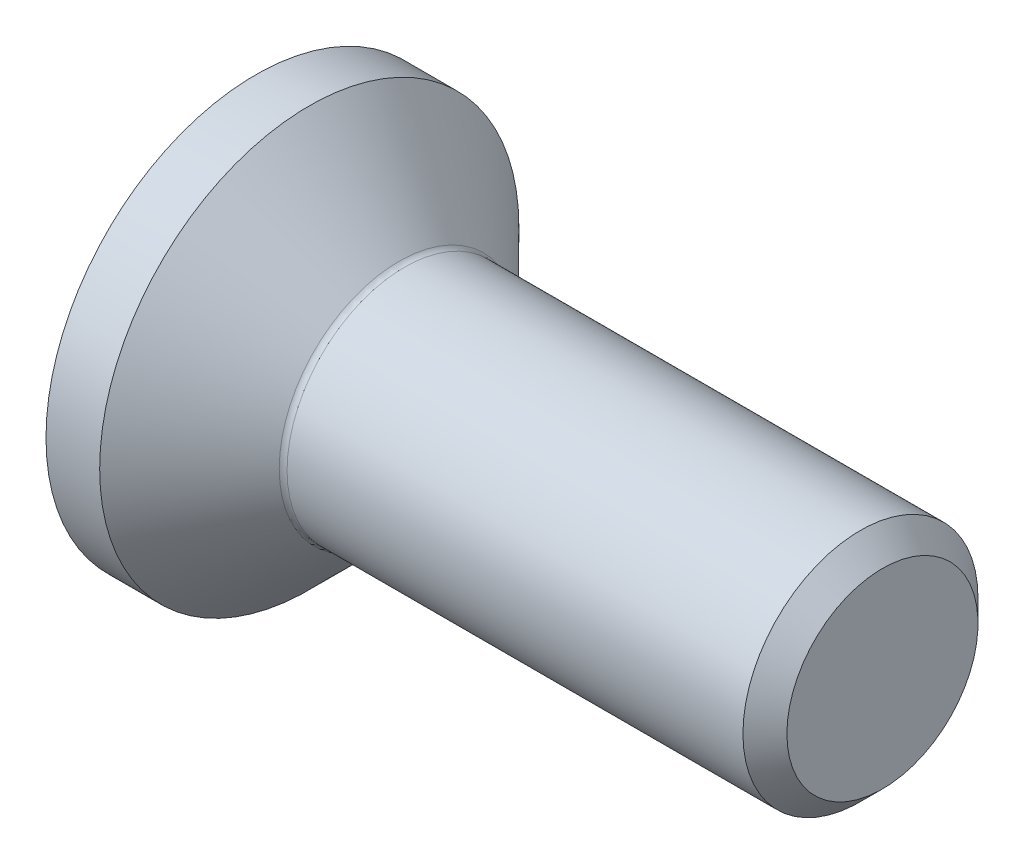
ISO-10303-21;
HEADER;
FILE_DESCRIPTION(('STEP AP214'),'2;1');
FILE_NAME('part.step','',(''),(''),'','','');
FILE_SCHEMA(('AUTOMOTIVE_DESIGN { 1 0 10303 214 1 1 1 1 }'));
ENDSEC;
DATA;
#1=APPLICATION_CONTEXT('core data for automotive mechanical design processes');
#2=APPLICATION_PROTOCOL_DEFINITION('international standard','automotive_design',2000,#1);
#3=PRODUCT_CONTEXT('',#1,'mechanical');
#4=PRODUCT('Part','Part','',(#3));
#5=PRODUCT_RELATED_PRODUCT_CATEGORY('part','',(#4));
#6=PRODUCT_DEFINITION_FORMATION('','',#4);
#7=PRODUCT_DEFINITION_CONTEXT('part definition',#1,'design');
#8=PRODUCT_DEFINITION('design','',#6,#7);
#9=PRODUCT_DEFINITION_SHAPE('','',#8);
#10=(LENGTH_UNIT() NAMED_UNIT(*) SI_UNIT(.MILLI.,.METRE.));
#11=(NAMED_UNIT(*) PLANE_ANGLE_UNIT() SI_UNIT($,.RADIAN.));
#12=(NAMED_UNIT(*) SI_UNIT($,.STERADIAN.) SOLID_ANGLE_UNIT());
#13=UNCERTAINTY_MEASURE_WITH_UNIT(LENGTH_MEASURE(1.E-05),#10,'distance_accuracy_value','');
#14=(GEOMETRIC_REPRESENTATION_CONTEXT(3) GLOBAL_UNCERTAINTY_ASSIGNED_CONTEXT((#13)) GLOBAL_UNIT_ASSIGNED_CONTEXT((#10,
#11,#12)) REPRESENTATION_CONTEXT('',''));
#15=CARTESIAN_POINT('',(0.,0.,0.));
#16=DIRECTION('',(0.,0.,1.));
#17=DIRECTION('',(1.,0.,0.));
#18=AXIS2_PLACEMENT_3D('',#15,#16,#17);
#19=CARTESIAN_POINT('',(0.,0.,0.));
#20=DIRECTION('',(-1.,0.,0.));
#21=DIRECTION('',(0.,0.,1.));
#22=AXIS2_PLACEMENT_3D('',#19,#20,#21);
#23=PLANE('',#22);
#24=CARTESIAN_POINT('',(0.,0.,0.));
#25=DIRECTION('',(-1.,0.,0.));
#26=DIRECTION('',(0.,0.,1.));
#27=AXIS2_PLACEMENT_3D('',#24,#25,#26);
#28=CIRCLE('',#27,2.675);
#29=CARTESIAN_POINT('',(0.,0.,2.675));
#30=VERTEX_POINT('',#29);
#31=EDGE_CURVE('E153',#30,#30,#28,.T.);
#32=ORIENTED_EDGE('',*,*,#31,.T.);
#33=EDGE_LOOP('',(#32));
#34=FACE_BOUND('',#33,.T.);
#35=DIRECTION('',(0.,-0.499999999999998,-0.86602540378444));
#36=VECTOR('',#35,1.);
#37=CARTESIAN_POINT('',(0.,-0.577350269189626,1.));
#38=LINE('',#37,#36);
#39=CARTESIAN_POINT('',(0.,-0.577350269189626,1.));
#40=VERTEX_POINT('',#39);
#41=CARTESIAN_POINT('',(0.,-1.15470053837925,0.));
#42=VERTEX_POINT('',#41);
#43=EDGE_CURVE('E119',#40,#42,#38,.T.);
#44=ORIENTED_EDGE('',*,*,#43,.T.);
#45=DIRECTION('',(0.,0.499999999999999,-0.866025403784439));
#46=VECTOR('',#45,1.);
#47=CARTESIAN_POINT('',(0.,-1.15470053837925,0.));
#48=LINE('',#47,#46);
#49=CARTESIAN_POINT('',(0.,-0.577350269189625,-1.));
#50=VERTEX_POINT('',#49);
#51=EDGE_CURVE('E50',#42,#50,#48,.T.);
#52=ORIENTED_EDGE('',*,*,#51,.T.);
#53=DIRECTION('',(0.,1.,0.));
#54=VECTOR('',#53,1.);
#55=CARTESIAN_POINT('',(0.,-0.577350269189625,-1.));
#56=LINE('',#55,#54);
#57=CARTESIAN_POINT('',(0.,0.577350269189626,-1.));
#58=VERTEX_POINT('',#57);
#59=EDGE_CURVE('E130',#50,#58,#56,.T.);
#60=ORIENTED_EDGE('',*,*,#59,.T.);
#61=DIRECTION('',(0.,0.5,0.866025403784439));
#62=VECTOR('',#61,1.);
#63=CARTESIAN_POINT('',(0.,0.577350269189626,-1.));
#64=LINE('',#63,#62);
#65=CARTESIAN_POINT('',(0.,1.15470053837925,0.));
#66=VERTEX_POINT('',#65);
#67=EDGE_CURVE('E254',#58,#66,#64,.T.);
#68=ORIENTED_EDGE('',*,*,#67,.T.);
#69=DIRECTION('',(0.,-0.499999999999999,0.866025403784439));
#70=VECTOR('',#69,1.);
#71=CARTESIAN_POINT('',(0.,1.15470053837925,0.));
#72=LINE('',#71,#70);
#73=CARTESIAN_POINT('',(0.,0.577350269189625,0.999999999999999));
#74=VERTEX_POINT('',#73);
#75=EDGE_CURVE('E257',#66,#74,#72,.T.);
#76=ORIENTED_EDGE('',*,*,#75,.T.);
#77=DIRECTION('',(0.,-1.,0.));
#78=VECTOR('',#77,1.);
#79=CARTESIAN_POINT('',(0.,0.577350269189625,0.999999999999999));
#80=LINE('',#79,#78);
#81=EDGE_CURVE('E260',#74,#40,#80,.T.);
#82=ORIENTED_EDGE('',*,*,#81,.T.);
#83=EDGE_LOOP('',(#44,#52,#60,#68,#76,#82));
#84=FACE_BOUND('',#83,.T.);
#85=ADVANCED_FACE('F35',(#34,#84),#23,.T.);
#86=CARTESIAN_POINT('',(0.,0.,0.));
#87=DIRECTION('',(-1.,0.,0.));
#88=DIRECTION('',(0.,0.,1.));
#89=AXIS2_PLACEMENT_3D('',#86,#87,#88);
#90=CYLINDRICAL_SURFACE('',#89,2.675);
#91=CARTESIAN_POINT('',(0.685000000000012,0.,0.));
#92=DIRECTION('',(-1.,0.,0.));
#93=DIRECTION('',(0.,0.,1.));
#94=AXIS2_PLACEMENT_3D('',#91,#92,#93);
#95=CIRCLE('',#94,2.675);
#96=CARTESIAN_POINT('',(0.685000000000012,0.,2.675));
#97=VERTEX_POINT('',#96);
#98=EDGE_CURVE('E150',#97,#97,#95,.T.);
#99=ORIENTED_EDGE('',*,*,#98,.T.);
#100=EDGE_LOOP('',(#99));
#101=FACE_BOUND('',#100,.T.);
#102=ORIENTED_EDGE('',*,*,#31,.F.);
#103=EDGE_LOOP('',(#102));
#104=FACE_BOUND('',#103,.T.);
#105=ADVANCED_FACE('F174',(#101,#104),#90,.T.);
#106=CARTESIAN_POINT('',(0.685000000000012,0.,0.));
#107=DIRECTION('',(-1.,0.,0.));
#108=DIRECTION('',(0.,0.,1.));
#109=AXIS2_PLACEMENT_3D('',#106,#107,#108);
#110=CONICAL_SURFACE('',#109,2.675,0.785398163397451);
#111=CARTESIAN_POINT('',(1.83071067811869,0.,0.));
#112=DIRECTION('',(-1.,0.,0.));
#113=DIRECTION('',(0.,0.,1.));
#114=AXIS2_PLACEMENT_3D('',#111,#112,#113);
#115=CIRCLE('',#114,1.52928932188132);
#116=CARTESIAN_POINT('',(1.83071067811869,0.,1.52928932188132));
#117=VERTEX_POINT('',#116);
#118=EDGE_CURVE('E43',#117,#117,#115,.T.);
#119=ORIENTED_EDGE('',*,*,#118,.T.);
#120=EDGE_LOOP('',(#119));
#121=FACE_BOUND('',#120,.T.);
#122=ORIENTED_EDGE('',*,*,#98,.F.);
#123=EDGE_LOOP('',(#122));
#124=FACE_BOUND('',#123,.T.);
#125=ADVANCED_FACE('F158',(#121,#124),#110,.T.);
#126=CARTESIAN_POINT('',(0.,0.,0.));
#127=DIRECTION('',(-1.,0.,0.));
#128=DIRECTION('',(0.,0.,1.));
#129=AXIS2_PLACEMENT_3D('',#126,#127,#128);
#130=CYLINDRICAL_SURFACE('',#129,1.49999999999998);
#131=CARTESIAN_POINT('',(1.90142135623734,0.,0.));
#132=DIRECTION('',(-1.,0.,0.));
#133=DIRECTION('',(0.,0.,1.));
#134=AXIS2_PLACEMENT_3D('',#131,#132,#133);
#135=CIRCLE('',#134,1.49999999999998);
#136=CARTESIAN_POINT('',(1.90142135623734,0.,1.49999999999998));
#137=VERTEX_POINT('',#136);
#138=EDGE_CURVE('E11',#137,#137,#135,.F.);
#139=ORIENTED_EDGE('',*,*,#138,.T.);
#140=EDGE_LOOP('',(#139));
#141=FACE_BOUND('',#140,.T.);
#142=CARTESIAN_POINT('',(7.71949999999996,0.,0.));
#143=DIRECTION('',(-1.,0.,0.));
#144=DIRECTION('',(0.,0.,1.));
#145=AXIS2_PLACEMENT_3D('',#142,#143,#144);
#146=CIRCLE('',#145,1.49999999999995);
#147=CARTESIAN_POINT('',(7.71949999999996,0.,1.49999999999995));
#148=VERTEX_POINT('',#147);
#149=EDGE_CURVE('E147',#148,#148,#146,.T.);
#150=ORIENTED_EDGE('',*,*,#149,.T.);
#151=EDGE_LOOP('',(#150));
#152=FACE_BOUND('',#151,.T.);
#153=ADVANCED_FACE('F185',(#141,#152),#130,.T.);
#154=CARTESIAN_POINT('',(8.,0.,0.));
#155=DIRECTION('',(-1.,0.,0.));
#156=DIRECTION('',(0.,0.,1.));
#157=AXIS2_PLACEMENT_3D('',#154,#155,#156);
#158=CONICAL_SURFACE('',#157,1.2195,0.785398163397284);
#159=ORIENTED_EDGE('',*,*,#149,.F.);
#160=EDGE_LOOP('',(#159));
#161=FACE_BOUND('',#160,.T.);
#162=CARTESIAN_POINT('',(8.,0.,0.));
#163=DIRECTION('',(-1.,0.,0.));
#164=DIRECTION('',(0.,0.,1.));
#165=AXIS2_PLACEMENT_3D('',#162,#163,#164);
#166=CIRCLE('',#165,1.2195);
#167=CARTESIAN_POINT('',(8.,0.,1.2195));
#168=VERTEX_POINT('',#167);
#169=EDGE_CURVE('E143',#168,#168,#166,.T.);
#170=ORIENTED_EDGE('',*,*,#169,.T.);
#171=EDGE_LOOP('',(#170));
#172=FACE_BOUND('',#171,.T.);
#173=ADVANCED_FACE('F169',(#161,#172),#158,.T.);
#174=CARTESIAN_POINT('',(8.,1.2195,0.));
#175=DIRECTION('',(1.,0.,0.));
#176=DIRECTION('',(0.,0.,-1.));
#177=AXIS2_PLACEMENT_3D('',#174,#175,#176);
#178=PLANE('',#177);
#179=ORIENTED_EDGE('',*,*,#169,.F.);
#180=EDGE_LOOP('',(#179));
#181=FACE_BOUND('',#180,.T.);
#182=ADVANCED_FACE('F162',(#181),#178,.T.);
#183=CARTESIAN_POINT('',(1.90142135623734,0.,0.));
#184=DIRECTION('',(-1.,0.,0.));
#185=DIRECTION('',(0.,0.,1.));
#186=AXIS2_PLACEMENT_3D('',#183,#184,#185);
#187=TOROIDAL_SURFACE('',#186,1.59999999999998,0.1);
#188=ORIENTED_EDGE('',*,*,#138,.F.);
#189=EDGE_LOOP('',(#188));
#190=FACE_BOUND('',#189,.T.);
#191=ORIENTED_EDGE('',*,*,#118,.F.);
#192=EDGE_LOOP('',(#191));
#193=FACE_BOUND('',#192,.T.);
#194=ADVANCED_FACE('F37',(#190,#193),#187,.F.);
#195=CARTESIAN_POINT('',(1.1,-1.15470053837925,0.));
#196=DIRECTION('',(0.,0.866025403784439,0.499999999999999));
#197=DIRECTION('',(0.,-0.499999999999999,0.866025403784439));
#198=AXIS2_PLACEMENT_3D('',#195,#196,#197);
#199=PLANE('',#198);
#200=ORIENTED_EDGE('',*,*,#51,.F.);
#201=DIRECTION('',(-1.,0.,0.));
#202=VECTOR('',#201,1.);
#203=CARTESIAN_POINT('',(1.1,-1.15470053837925,0.));
#204=LINE('',#203,#202);
#205=CARTESIAN_POINT('',(1.1,-1.15470053837925,0.));
#206=VERTEX_POINT('',#205);
#207=EDGE_CURVE('E251',#206,#42,#204,.T.);
#208=ORIENTED_EDGE('',*,*,#207,.F.);
#209=DIRECTION('',(0.,0.499999999999999,-0.866025403784439));
#210=VECTOR('',#209,1.);
#211=CARTESIAN_POINT('',(1.1,-1.15470053837925,0.));
#212=LINE('',#211,#210);
#213=CARTESIAN_POINT('',(1.1,-0.866025403784438,-0.499999999999998));
#214=VERTEX_POINT('',#213);
#215=EDGE_CURVE('E115',#206,#214,#212,.T.);
#216=ORIENTED_EDGE('',*,*,#215,.T.);
#217=CARTESIAN_POINT('',(1.1,-0.577350269189625,-1.));
#218=VERTEX_POINT('',#217);
#219=EDGE_CURVE('E111',#214,#218,#212,.T.);
#220=ORIENTED_EDGE('',*,*,#219,.T.);
#221=DIRECTION('',(-1.,0.,0.));
#222=VECTOR('',#221,1.);
#223=CARTESIAN_POINT('',(1.1,-0.577350269189625,-1.));
#224=LINE('',#223,#222);
#225=EDGE_CURVE('E113',#218,#50,#224,.T.);
#226=ORIENTED_EDGE('',*,*,#225,.T.);
#227=EDGE_LOOP('',(#200,#208,#216,#220,#226));
#228=FACE_BOUND('',#227,.T.);
#229=ADVANCED_FACE('F112',(#228),#199,.T.);
#230=CARTESIAN_POINT('',(1.1,-0.577350269189625,-1.));
#231=DIRECTION('',(0.,0.,1.));
#232=DIRECTION('',(1.,0.,0.));
#233=AXIS2_PLACEMENT_3D('',#230,#231,#232);
#234=PLANE('',#233);
#235=ORIENTED_EDGE('',*,*,#59,.F.);
#236=ORIENTED_EDGE('',*,*,#225,.F.);
#237=DIRECTION('',(0.,1.,0.));
#238=VECTOR('',#237,1.);
#239=CARTESIAN_POINT('',(1.1,-0.577350269189625,-1.));
#240=LINE('',#239,#238);
#241=CARTESIAN_POINT('',(1.1,0.,-1.));
#242=VERTEX_POINT('',#241);
#243=EDGE_CURVE('E58',#218,#242,#240,.T.);
#244=ORIENTED_EDGE('',*,*,#243,.T.);
#245=CARTESIAN_POINT('',(1.1,0.577350269189626,-1.));
#246=VERTEX_POINT('',#245);
#247=EDGE_CURVE('E125',#242,#246,#240,.T.);
#248=ORIENTED_EDGE('',*,*,#247,.T.);
#249=DIRECTION('',(-1.,0.,0.));
#250=VECTOR('',#249,1.);
#251=CARTESIAN_POINT('',(1.1,0.577350269189626,-1.));
#252=LINE('',#251,#250);
#253=EDGE_CURVE('E132',#246,#58,#252,.T.);
#254=ORIENTED_EDGE('',*,*,#253,.T.);
#255=EDGE_LOOP('',(#235,#236,#244,#248,#254));
#256=FACE_BOUND('',#255,.T.);
#257=ADVANCED_FACE('F127',(#256),#234,.T.);
#258=CARTESIAN_POINT('',(1.1,0.577350269189626,-1.));
#259=DIRECTION('',(0.,-0.866025403784438,0.5));
#260=DIRECTION('',(0.,-0.5,-0.866025403784439));
#261=AXIS2_PLACEMENT_3D('',#258,#259,#260);
#262=PLANE('',#261);
#263=ORIENTED_EDGE('',*,*,#67,.F.);
#264=ORIENTED_EDGE('',*,*,#253,.F.);
#265=DIRECTION('',(0.,0.5,0.866025403784439));
#266=VECTOR('',#265,1.);
#267=CARTESIAN_POINT('',(1.1,0.577350269189626,-1.));
#268=LINE('',#267,#266);
#269=CARTESIAN_POINT('',(1.1,0.866025403784439,-0.5));
#270=VERTEX_POINT('',#269);
#271=EDGE_CURVE('E232',#246,#270,#268,.T.);
#272=ORIENTED_EDGE('',*,*,#271,.T.);
#273=CARTESIAN_POINT('',(1.1,1.15470053837925,0.));
#274=VERTEX_POINT('',#273);
#275=EDGE_CURVE('E124',#270,#274,#268,.T.);
#276=ORIENTED_EDGE('',*,*,#275,.T.);
#277=DIRECTION('',(-1.,0.,0.));
#278=VECTOR('',#277,1.);
#279=CARTESIAN_POINT('',(1.1,1.15470053837925,0.));
#280=LINE('',#279,#278);
#281=EDGE_CURVE('E138',#274,#66,#280,.T.);
#282=ORIENTED_EDGE('',*,*,#281,.T.);
#283=EDGE_LOOP('',(#263,#264,#272,#276,#282));
#284=FACE_BOUND('',#283,.T.);
#285=ADVANCED_FACE('F199',(#284),#262,.T.);
#286=CARTESIAN_POINT('',(1.1,1.15470053837925,0.));
#287=DIRECTION('',(0.,-0.866025403784439,-0.499999999999999));
#288=DIRECTION('',(0.,0.499999999999999,-0.866025403784439));
#289=AXIS2_PLACEMENT_3D('',#286,#287,#288);
#290=PLANE('',#289);
#291=ORIENTED_EDGE('',*,*,#75,.F.);
#292=ORIENTED_EDGE('',*,*,#281,.F.);
#293=DIRECTION('',(0.,-0.499999999999999,0.866025403784439));
#294=VECTOR('',#293,1.);
#295=CARTESIAN_POINT('',(1.1,1.15470053837925,0.));
#296=LINE('',#295,#294);
#297=CARTESIAN_POINT('',(1.1,0.866025403784438,0.499999999999999));
#298=VERTEX_POINT('',#297);
#299=EDGE_CURVE('E239',#274,#298,#296,.T.);
#300=ORIENTED_EDGE('',*,*,#299,.T.);
#301=CARTESIAN_POINT('',(1.1,0.577350269189625,0.999999999999999));
#302=VERTEX_POINT('',#301);
#303=EDGE_CURVE('E237',#298,#302,#296,.T.);
#304=ORIENTED_EDGE('',*,*,#303,.T.);
#305=DIRECTION('',(-1.,0.,0.));
#306=VECTOR('',#305,1.);
#307=CARTESIAN_POINT('',(1.1,0.577350269189625,0.999999999999999));
#308=LINE('',#307,#306);
#309=EDGE_CURVE('E269',#302,#74,#308,.T.);
#310=ORIENTED_EDGE('',*,*,#309,.T.);
#311=EDGE_LOOP('',(#291,#292,#300,#304,#310));
#312=FACE_BOUND('',#311,.T.);
#313=ADVANCED_FACE('F202',(#312),#290,.T.);
#314=CARTESIAN_POINT('',(1.1,0.577350269189625,0.999999999999999));
#315=DIRECTION('',(0.,0.,-1.));
#316=DIRECTION('',(0.,1.,0.));
#317=AXIS2_PLACEMENT_3D('',#314,#315,#316);
#318=PLANE('',#317);
#319=ORIENTED_EDGE('',*,*,#81,.F.);
#320=ORIENTED_EDGE('',*,*,#309,.F.);
#321=DIRECTION('',(0.,-1.,0.));
#322=VECTOR('',#321,1.);
#323=CARTESIAN_POINT('',(1.1,0.577350269189625,0.999999999999999));
#324=LINE('',#323,#322);
#325=CARTESIAN_POINT('',(1.1,0.,1.));
#326=VERTEX_POINT('',#325);
#327=EDGE_CURVE('E244',#302,#326,#324,.T.);
#328=ORIENTED_EDGE('',*,*,#327,.T.);
#329=CARTESIAN_POINT('',(1.1,-0.577350269189626,1.));
#330=VERTEX_POINT('',#329);
#331=EDGE_CURVE('E243',#326,#330,#324,.T.);
#332=ORIENTED_EDGE('',*,*,#331,.T.);
#333=DIRECTION('',(-1.,0.,0.));
#334=VECTOR('',#333,1.);
#335=CARTESIAN_POINT('',(1.1,-0.577350269189626,1.));
#336=LINE('',#335,#334);
#337=EDGE_CURVE('E266',#330,#40,#336,.T.);
#338=ORIENTED_EDGE('',*,*,#337,.T.);
#339=EDGE_LOOP('',(#319,#320,#328,#332,#338));
#340=FACE_BOUND('',#339,.T.);
#341=ADVANCED_FACE('F206',(#340),#318,.T.);
#342=CARTESIAN_POINT('',(1.1,-0.577350269189626,1.));
#343=DIRECTION('',(0.,0.86602540378444,-0.499999999999998));
#344=DIRECTION('',(0.,0.499999999999998,0.86602540378444));
#345=AXIS2_PLACEMENT_3D('',#342,#343,#344);
#346=PLANE('',#345);
#347=ORIENTED_EDGE('',*,*,#43,.F.);
#348=ORIENTED_EDGE('',*,*,#337,.F.);
#349=DIRECTION('',(0.,-0.499999999999998,-0.86602540378444));
#350=VECTOR('',#349,1.);
#351=CARTESIAN_POINT('',(1.1,-0.577350269189626,1.));
#352=LINE('',#351,#350);
#353=CARTESIAN_POINT('',(1.1,-0.866025403784439,0.499999999999997));
#354=VERTEX_POINT('',#353);
#355=EDGE_CURVE('E248',#330,#354,#352,.T.);
#356=ORIENTED_EDGE('',*,*,#355,.T.);
#357=EDGE_CURVE('E247',#354,#206,#352,.T.);
#358=ORIENTED_EDGE('',*,*,#357,.T.);
#359=ORIENTED_EDGE('',*,*,#207,.T.);
#360=EDGE_LOOP('',(#347,#348,#356,#358,#359));
#361=FACE_BOUND('',#360,.T.);
#362=ADVANCED_FACE('F210',(#361),#346,.T.);
#363=CARTESIAN_POINT('',(1.1,-0.577350269189626,-1.));
#364=DIRECTION('',(1.,0.,0.));
#365=DIRECTION('',(0.,0.,-1.));
#366=AXIS2_PLACEMENT_3D('',#363,#364,#365);
#367=PLANE('',#366);
#368=ORIENTED_EDGE('',*,*,#243,.F.);
#369=ORIENTED_EDGE('',*,*,#219,.F.);
#370=CARTESIAN_POINT('',(1.1,0.,0.));
#371=DIRECTION('',(-1.,0.,0.));
#372=DIRECTION('',(0.,0.,1.));
#373=AXIS2_PLACEMENT_3D('',#370,#371,#372);
#374=CIRCLE('',#373,1.);
#375=EDGE_CURVE('E122',#242,#214,#374,.T.);
#376=ORIENTED_EDGE('',*,*,#375,.F.);
#377=EDGE_LOOP('',(#368,#369,#376));
#378=FACE_BOUND('',#377,.T.);
#379=ADVANCED_FACE('F121',(#378),#367,.F.);
#380=ORIENTED_EDGE('',*,*,#215,.F.);
#381=ORIENTED_EDGE('',*,*,#357,.F.);
#382=EDGE_CURVE('E135',#214,#354,#374,.T.);
#383=ORIENTED_EDGE('',*,*,#382,.F.);
#384=EDGE_LOOP('',(#380,#381,#383));
#385=FACE_BOUND('',#384,.T.);
#386=ADVANCED_FACE('F216',(#385),#367,.F.);
#387=ORIENTED_EDGE('',*,*,#355,.F.);
#388=ORIENTED_EDGE('',*,*,#331,.F.);
#389=EDGE_CURVE('E131',#354,#326,#374,.T.);
#390=ORIENTED_EDGE('',*,*,#389,.F.);
#391=EDGE_LOOP('',(#387,#388,#390));
#392=FACE_BOUND('',#391,.T.);
#393=ADVANCED_FACE('F220',(#392),#367,.F.);
#394=ORIENTED_EDGE('',*,*,#327,.F.);
#395=ORIENTED_EDGE('',*,*,#303,.F.);
#396=EDGE_CURVE('E137',#326,#298,#374,.T.);
#397=ORIENTED_EDGE('',*,*,#396,.F.);
#398=EDGE_LOOP('',(#394,#395,#397));
#399=FACE_BOUND('',#398,.T.);
#400=ADVANCED_FACE('F228',(#399),#367,.F.);
#401=ORIENTED_EDGE('',*,*,#299,.F.);
#402=ORIENTED_EDGE('',*,*,#275,.F.);
#403=EDGE_CURVE('E144',#298,#270,#374,.T.);
#404=ORIENTED_EDGE('',*,*,#403,.F.);
#405=EDGE_LOOP('',(#401,#402,#404));
#406=FACE_BOUND('',#405,.T.);
#407=ADVANCED_FACE('F223',(#406),#367,.F.);
#408=ORIENTED_EDGE('',*,*,#271,.F.);
#409=ORIENTED_EDGE('',*,*,#247,.F.);
#410=EDGE_CURVE('E233',#270,#242,#374,.T.);
#411=ORIENTED_EDGE('',*,*,#410,.F.);
#412=EDGE_LOOP('',(#408,#409,#411));
#413=FACE_BOUND('',#412,.T.);
#414=ADVANCED_FACE('F194',(#413),#367,.F.);
#415=CARTESIAN_POINT('',(1.1,0.,0.));
#416=DIRECTION('',(-1.,0.,0.));
#417=DIRECTION('',(0.,0.,1.));
#418=AXIS2_PLACEMENT_3D('',#415,#416,#417);
#419=CONICAL_SURFACE('',#418,1.,1.04719755119659);
#420=CARTESIAN_POINT('',(1.67735026918963,0.,0.));
#421=VERTEX_POINT('',#420);
#422=VERTEX_LOOP('',#421);
#423=FACE_BOUND('',#422,.T.);
#424=ORIENTED_EDGE('',*,*,#396,.T.);
#425=ORIENTED_EDGE('',*,*,#403,.T.);
#426=ORIENTED_EDGE('',*,*,#410,.T.);
#427=ORIENTED_EDGE('',*,*,#375,.T.);
#428=ORIENTED_EDGE('',*,*,#382,.T.);
#429=ORIENTED_EDGE('',*,*,#389,.T.);
#430=EDGE_LOOP('',(#424,#425,#426,#427,#428,#429));
#431=FACE_BOUND('',#430,.T.);
#432=ADVANCED_FACE('F192',(#423,#431),#419,.F.);
#433=CLOSED_SHELL('',(#85,#105,#125,#153,#173,#182,#194,#229,#257,#285,#313,#341,#362,#379,#386,
#393,#400,#407,#414,#432));
#434=MANIFOLD_SOLID_BREP('B2',#433);
#435=ADVANCED_BREP_SHAPE_REPRESENTATION('',(#18,#434),#14);
#436=SHAPE_DEFINITION_REPRESENTATION(#9,#435);
ENDSEC;
END-ISO-10303-21;
